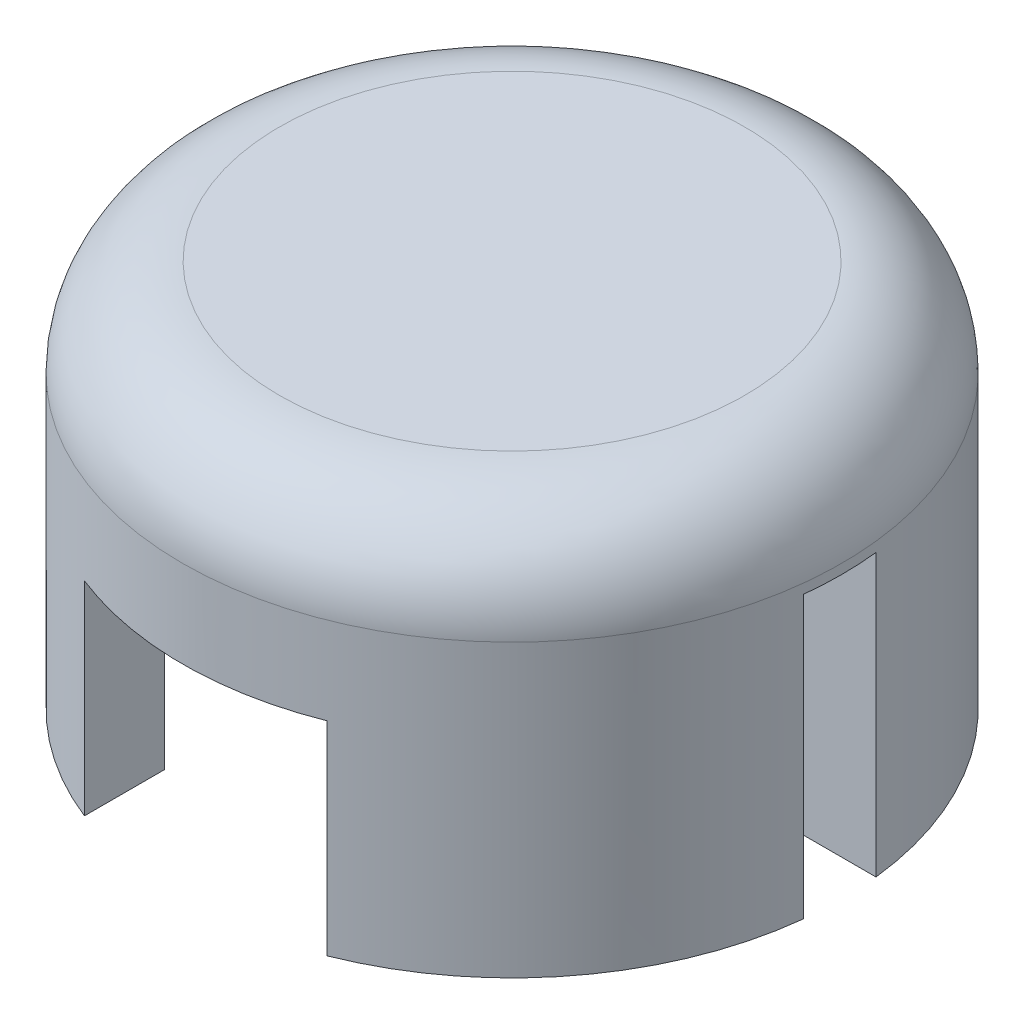
ISO-10303-21;
HEADER;
FILE_DESCRIPTION(('STEP AP214'),'2;1');
FILE_NAME('part.step','',(''),(''),'','','');
FILE_SCHEMA(('AUTOMOTIVE_DESIGN { 1 0 10303 214 1 1 1 1 }'));
ENDSEC;
DATA;
#1=APPLICATION_CONTEXT('core data for automotive mechanical design processes');
#2=APPLICATION_PROTOCOL_DEFINITION('international standard','automotive_design',2000,#1);
#3=PRODUCT_CONTEXT('',#1,'mechanical');
#4=PRODUCT('Part','Part','',(#3));
#5=PRODUCT_RELATED_PRODUCT_CATEGORY('part','',(#4));
#6=PRODUCT_DEFINITION_FORMATION('','',#4);
#7=PRODUCT_DEFINITION_CONTEXT('part definition',#1,'design');
#8=PRODUCT_DEFINITION('design','',#6,#7);
#9=PRODUCT_DEFINITION_SHAPE('','',#8);
#10=(LENGTH_UNIT() NAMED_UNIT(*) SI_UNIT(.MILLI.,.METRE.));
#11=(NAMED_UNIT(*) PLANE_ANGLE_UNIT() SI_UNIT($,.RADIAN.));
#12=(NAMED_UNIT(*) SI_UNIT($,.STERADIAN.) SOLID_ANGLE_UNIT());
#13=UNCERTAINTY_MEASURE_WITH_UNIT(LENGTH_MEASURE(1.E-05),#10,'distance_accuracy_value','');
#14=(GEOMETRIC_REPRESENTATION_CONTEXT(3) GLOBAL_UNCERTAINTY_ASSIGNED_CONTEXT((#13)) GLOBAL_UNIT_ASSIGNED_CONTEXT((#10,
#11,#12)) REPRESENTATION_CONTEXT('',''));
#15=CARTESIAN_POINT('',(0.,0.,0.));
#16=DIRECTION('',(0.,0.,1.));
#17=DIRECTION('',(1.,0.,0.));
#18=AXIS2_PLACEMENT_3D('',#15,#16,#17);
#19=CARTESIAN_POINT('',(0.,0.,0.));
#20=DIRECTION('',(0.,1.,0.));
#21=DIRECTION('',(0.,0.,1.));
#22=AXIS2_PLACEMENT_3D('',#19,#20,#21);
#23=PLANE('',#22);
#24=CARTESIAN_POINT('',(0.,0.,0.));
#25=DIRECTION('',(0.,1.,0.));
#26=DIRECTION('',(0.,0.,1.));
#27=AXIS2_PLACEMENT_3D('',#24,#25,#26);
#28=CIRCLE('',#27,5.3);
#29=CARTESIAN_POINT('',(2.5,0.,4.67332857821917));
#30=VERTEX_POINT('',#29);
#31=CARTESIAN_POINT('',(5.2466656077932,0.,0.75));
#32=VERTEX_POINT('',#31);
#33=EDGE_CURVE('E212',#30,#32,#28,.T.);
#34=ORIENTED_EDGE('',*,*,#33,.T.);
#35=DIRECTION('',(1.,0.,0.));
#36=VECTOR('',#35,1.);
#37=CARTESIAN_POINT('',(-6.8,0.,0.75));
#38=LINE('',#37,#36);
#39=CARTESIAN_POINT('',(6.75851315009448,0.,0.75));
#40=VERTEX_POINT('',#39);
#41=EDGE_CURVE('E251',#32,#40,#38,.T.);
#42=ORIENTED_EDGE('',*,*,#41,.T.);
#43=CARTESIAN_POINT('',(0.,0.,0.));
#44=DIRECTION('',(0.,1.,0.));
#45=DIRECTION('',(0.,0.,1.));
#46=AXIS2_PLACEMENT_3D('',#43,#44,#45);
#47=CIRCLE('',#46,6.8);
#48=CARTESIAN_POINT('',(2.5,0.,6.32376470150495));
#49=VERTEX_POINT('',#48);
#50=EDGE_CURVE('E219',#49,#40,#47,.T.);
#51=ORIENTED_EDGE('',*,*,#50,.F.);
#52=DIRECTION('',(0.,0.,-1.));
#53=VECTOR('',#52,1.);
#54=CARTESIAN_POINT('',(2.5,0.,6.8));
#55=LINE('',#54,#53);
#56=EDGE_CURVE('E181',#49,#30,#55,.T.);
#57=ORIENTED_EDGE('',*,*,#56,.T.);
#58=EDGE_LOOP('',(#34,#42,#51,#57));
#59=FACE_BOUND('',#58,.T.);
#60=ADVANCED_FACE('F39',(#59),#23,.F.);
#61=CARTESIAN_POINT('',(-6.75851315009448,0.,0.75));
#62=VERTEX_POINT('',#61);
#63=CARTESIAN_POINT('',(-2.5,0.,6.32376470150495));
#64=VERTEX_POINT('',#63);
#65=EDGE_CURVE('E216',#62,#64,#47,.T.);
#66=ORIENTED_EDGE('',*,*,#65,.F.);
#67=CARTESIAN_POINT('',(-5.2466656077932,0.,0.75));
#68=VERTEX_POINT('',#67);
#69=EDGE_CURVE('E282',#62,#68,#38,.T.);
#70=ORIENTED_EDGE('',*,*,#69,.T.);
#71=CARTESIAN_POINT('',(-2.5,0.,4.67332857821917));
#72=VERTEX_POINT('',#71);
#73=EDGE_CURVE('E218',#68,#72,#28,.T.);
#74=ORIENTED_EDGE('',*,*,#73,.T.);
#75=DIRECTION('',(0.,0.,-1.));
#76=VECTOR('',#75,1.);
#77=CARTESIAN_POINT('',(-2.5,0.,6.8));
#78=LINE('',#77,#76);
#79=EDGE_CURVE('E185',#64,#72,#78,.T.);
#80=ORIENTED_EDGE('',*,*,#79,.F.);
#81=EDGE_LOOP('',(#66,#70,#74,#80));
#82=FACE_BOUND('',#81,.T.);
#83=ADVANCED_FACE('F293',(#82),#23,.F.);
#84=CARTESIAN_POINT('',(0.,5.8,0.));
#85=DIRECTION('',(0.,-1.,0.));
#86=DIRECTION('',(0.,0.,-1.));
#87=AXIS2_PLACEMENT_3D('',#84,#85,#86);
#88=CYLINDRICAL_SURFACE('',#87,5.3);
#89=DIRECTION('',(0.,-1.,0.));
#90=VECTOR('',#89,1.);
#91=CARTESIAN_POINT('',(-5.2466656077932,5.8,0.75));
#92=LINE('',#91,#90);
#93=CARTESIAN_POINT('',(-5.2466656077932,5.8,0.75));
#94=VERTEX_POINT('',#93);
#95=EDGE_CURVE('E171',#94,#68,#92,.T.);
#96=ORIENTED_EDGE('',*,*,#95,.F.);
#97=CARTESIAN_POINT('',(0.,5.8,0.));
#98=DIRECTION('',(0.,1.,0.));
#99=DIRECTION('',(0.,0.,1.));
#100=AXIS2_PLACEMENT_3D('',#97,#98,#99);
#101=CIRCLE('',#100,5.3);
#102=CARTESIAN_POINT('',(5.2466656077932,5.8,0.75));
#103=VERTEX_POINT('',#102);
#104=EDGE_CURVE('E207',#94,#103,#101,.T.);
#105=ORIENTED_EDGE('',*,*,#104,.T.);
#106=DIRECTION('',(0.,-1.,0.));
#107=VECTOR('',#106,1.);
#108=CARTESIAN_POINT('',(5.2466656077932,5.8,0.75));
#109=LINE('',#108,#107);
#110=EDGE_CURVE('E164',#32,#103,#109,.F.);
#111=ORIENTED_EDGE('',*,*,#110,.F.);
#112=ORIENTED_EDGE('',*,*,#33,.F.);
#113=DIRECTION('',(0.,-1.,0.));
#114=VECTOR('',#113,1.);
#115=CARTESIAN_POINT('',(2.5,5.8,4.67332857821917));
#116=LINE('',#115,#114);
#117=CARTESIAN_POINT('',(2.5,4.2,4.67332857821917));
#118=VERTEX_POINT('',#117);
#119=EDGE_CURVE('E48',#30,#118,#116,.F.);
#120=ORIENTED_EDGE('',*,*,#119,.T.);
#121=CARTESIAN_POINT('',(0.,4.2,0.));
#122=DIRECTION('',(0.,-1.,0.));
#123=DIRECTION('',(0.,0.,-1.));
#124=AXIS2_PLACEMENT_3D('',#121,#122,#123);
#125=CIRCLE('',#124,5.3);
#126=CARTESIAN_POINT('',(-2.5,4.2,4.67332857821917));
#127=VERTEX_POINT('',#126);
#128=EDGE_CURVE('E234',#118,#127,#125,.T.);
#129=ORIENTED_EDGE('',*,*,#128,.T.);
#130=DIRECTION('',(0.,-1.,0.));
#131=VECTOR('',#130,1.);
#132=CARTESIAN_POINT('',(-2.5,5.8,4.67332857821917));
#133=LINE('',#132,#131);
#134=EDGE_CURVE('E230',#127,#72,#133,.T.);
#135=ORIENTED_EDGE('',*,*,#134,.T.);
#136=ORIENTED_EDGE('',*,*,#73,.F.);
#137=EDGE_LOOP('',(#96,#105,#111,#112,#120,#129,#135,#136));
#138=FACE_BOUND('',#137,.T.);
#139=ADVANCED_FACE('F242',(#138),#88,.F.);
#140=CARTESIAN_POINT('',(6.75851315009448,0.,-0.75));
#141=VERTEX_POINT('',#140);
#142=CARTESIAN_POINT('',(-6.75851315009448,0.,-0.75));
#143=VERTEX_POINT('',#142);
#144=EDGE_CURVE('E157',#141,#143,#47,.T.);
#145=ORIENTED_EDGE('',*,*,#144,.F.);
#146=DIRECTION('',(1.,0.,0.));
#147=VECTOR('',#146,1.);
#148=CARTESIAN_POINT('',(-6.8,0.,-0.75));
#149=LINE('',#148,#147);
#150=CARTESIAN_POINT('',(5.2466656077932,0.,-0.75));
#151=VERTEX_POINT('',#150);
#152=EDGE_CURVE('E276',#151,#141,#149,.T.);
#153=ORIENTED_EDGE('',*,*,#152,.F.);
#154=CARTESIAN_POINT('',(-5.2466656077932,0.,-0.75));
#155=VERTEX_POINT('',#154);
#156=EDGE_CURVE('E217',#151,#155,#28,.T.);
#157=ORIENTED_EDGE('',*,*,#156,.T.);
#158=EDGE_CURVE('E55',#143,#155,#149,.T.);
#159=ORIENTED_EDGE('',*,*,#158,.F.);
#160=EDGE_LOOP('',(#145,#153,#157,#159));
#161=FACE_BOUND('',#160,.T.);
#162=ADVANCED_FACE('F320',(#161),#23,.F.);
#163=CARTESIAN_POINT('',(0.,5.8,0.));
#164=DIRECTION('',(0.,-1.,0.));
#165=DIRECTION('',(0.,0.,-1.));
#166=AXIS2_PLACEMENT_3D('',#163,#164,#165);
#167=CYLINDRICAL_SURFACE('',#166,6.8);
#168=CARTESIAN_POINT('',(0.,6.,0.));
#169=DIRECTION('',(0.,1.,0.));
#170=DIRECTION('',(0.,0.,1.));
#171=AXIS2_PLACEMENT_3D('',#168,#169,#170);
#172=CIRCLE('',#171,6.8);
#173=CARTESIAN_POINT('',(0.,6.,6.8));
#174=VERTEX_POINT('',#173);
#175=EDGE_CURVE('E226',#174,#174,#172,.F.);
#176=ORIENTED_EDGE('',*,*,#175,.T.);
#177=EDGE_LOOP('',(#176));
#178=FACE_BOUND('',#177,.T.);
#179=ORIENTED_EDGE('',*,*,#50,.T.);
#180=DIRECTION('',(0.,-1.,0.));
#181=VECTOR('',#180,1.);
#182=CARTESIAN_POINT('',(6.75851315009448,5.8,0.75));
#183=LINE('',#182,#181);
#184=CARTESIAN_POINT('',(6.75851315009448,5.8,0.75));
#185=VERTEX_POINT('',#184);
#186=EDGE_CURVE('E174',#40,#185,#183,.F.);
#187=ORIENTED_EDGE('',*,*,#186,.T.);
#188=CARTESIAN_POINT('',(0.,5.8,0.));
#189=DIRECTION('',(0.,1.,0.));
#190=DIRECTION('',(0.,0.,1.));
#191=AXIS2_PLACEMENT_3D('',#188,#189,#190);
#192=CIRCLE('',#191,6.8);
#193=CARTESIAN_POINT('',(6.75851315009448,5.8,-0.75));
#194=VERTEX_POINT('',#193);
#195=EDGE_CURVE('E143',#185,#194,#192,.T.);
#196=ORIENTED_EDGE('',*,*,#195,.T.);
#197=DIRECTION('',(0.,-1.,0.));
#198=VECTOR('',#197,1.);
#199=CARTESIAN_POINT('',(6.75851315009448,5.8,-0.75));
#200=LINE('',#199,#198);
#201=EDGE_CURVE('E159',#194,#141,#200,.T.);
#202=ORIENTED_EDGE('',*,*,#201,.T.);
#203=ORIENTED_EDGE('',*,*,#144,.T.);
#204=DIRECTION('',(0.,-1.,0.));
#205=VECTOR('',#204,1.);
#206=CARTESIAN_POINT('',(-6.75851315009448,5.8,-0.75));
#207=LINE('',#206,#205);
#208=CARTESIAN_POINT('',(-6.75851315009448,5.8,-0.75));
#209=VERTEX_POINT('',#208);
#210=EDGE_CURVE('E147',#143,#209,#207,.F.);
#211=ORIENTED_EDGE('',*,*,#210,.T.);
#212=CARTESIAN_POINT('',(-6.75851315009448,5.8,0.75));
#213=VERTEX_POINT('',#212);
#214=EDGE_CURVE('E130',#209,#213,#192,.T.);
#215=ORIENTED_EDGE('',*,*,#214,.T.);
#216=DIRECTION('',(0.,-1.,0.));
#217=VECTOR('',#216,1.);
#218=CARTESIAN_POINT('',(-6.75851315009448,5.8,0.75));
#219=LINE('',#218,#217);
#220=EDGE_CURVE('E144',#213,#62,#219,.T.);
#221=ORIENTED_EDGE('',*,*,#220,.T.);
#222=ORIENTED_EDGE('',*,*,#65,.T.);
#223=DIRECTION('',(0.,-1.,0.));
#224=VECTOR('',#223,1.);
#225=CARTESIAN_POINT('',(-2.5,5.8,6.32376470150495));
#226=LINE('',#225,#224);
#227=CARTESIAN_POINT('',(-2.5,4.2,6.32376470150495));
#228=VERTEX_POINT('',#227);
#229=EDGE_CURVE('E197',#228,#64,#226,.T.);
#230=ORIENTED_EDGE('',*,*,#229,.F.);
#231=CARTESIAN_POINT('',(0.,4.2,0.));
#232=DIRECTION('',(0.,-1.,0.));
#233=DIRECTION('',(0.,0.,-1.));
#234=AXIS2_PLACEMENT_3D('',#231,#232,#233);
#235=CIRCLE('',#234,6.8);
#236=CARTESIAN_POINT('',(2.5,4.2,6.32376470150495));
#237=VERTEX_POINT('',#236);
#238=EDGE_CURVE('E201',#237,#228,#235,.T.);
#239=ORIENTED_EDGE('',*,*,#238,.F.);
#240=DIRECTION('',(0.,-1.,0.));
#241=VECTOR('',#240,1.);
#242=CARTESIAN_POINT('',(2.5,5.8,6.32376470150495));
#243=LINE('',#242,#241);
#244=EDGE_CURVE('E204',#49,#237,#243,.F.);
#245=ORIENTED_EDGE('',*,*,#244,.F.);
#246=EDGE_LOOP('',(#179,#187,#196,#202,#203,#211,#215,#221,#222,#230,#239,#245));
#247=FACE_BOUND('',#246,.T.);
#248=ADVANCED_FACE('F154',(#178,#247),#167,.T.);
#249=DIRECTION('',(0.,-1.,0.));
#250=VECTOR('',#249,1.);
#251=CARTESIAN_POINT('',(5.2466656077932,5.8,-0.75));
#252=LINE('',#251,#250);
#253=CARTESIAN_POINT('',(5.2466656077932,5.8,-0.75));
#254=VERTEX_POINT('',#253);
#255=EDGE_CURVE('E160',#254,#151,#252,.T.);
#256=ORIENTED_EDGE('',*,*,#255,.F.);
#257=CARTESIAN_POINT('',(-5.2466656077932,5.8,-0.75));
#258=VERTEX_POINT('',#257);
#259=EDGE_CURVE('E211',#254,#258,#101,.T.);
#260=ORIENTED_EDGE('',*,*,#259,.T.);
#261=DIRECTION('',(0.,-1.,0.));
#262=VECTOR('',#261,1.);
#263=CARTESIAN_POINT('',(-5.2466656077932,5.8,-0.75));
#264=LINE('',#263,#262);
#265=EDGE_CURVE('E148',#155,#258,#264,.F.);
#266=ORIENTED_EDGE('',*,*,#265,.F.);
#267=ORIENTED_EDGE('',*,*,#156,.F.);
#268=EDGE_LOOP('',(#256,#260,#266,#267));
#269=FACE_BOUND('',#268,.T.);
#270=ADVANCED_FACE('F270',(#269),#88,.F.);
#271=CARTESIAN_POINT('',(0.,5.8,0.));
#272=DIRECTION('',(0.,1.,0.));
#273=DIRECTION('',(0.,0.,1.));
#274=AXIS2_PLACEMENT_3D('',#271,#272,#273);
#275=PLANE('',#274);
#276=CARTESIAN_POINT('',(0.,5.8,0.));
#277=DIRECTION('',(0.,1.,0.));
#278=DIRECTION('',(0.,0.,1.));
#279=AXIS2_PLACEMENT_3D('',#276,#277,#278);
#280=CIRCLE('',#279,3.);
#281=CARTESIAN_POINT('',(0.,5.8,3.));
#282=VERTEX_POINT('',#281);
#283=EDGE_CURVE('E11',#282,#282,#280,.F.);
#284=ORIENTED_EDGE('',*,*,#283,.F.);
#285=EDGE_LOOP('',(#284));
#286=FACE_BOUND('',#285,.T.);
#287=ORIENTED_EDGE('',*,*,#259,.F.);
#288=DIRECTION('',(1.,0.,0.));
#289=VECTOR('',#288,1.);
#290=CARTESIAN_POINT('',(-6.8,5.8,-0.75));
#291=LINE('',#290,#289);
#292=EDGE_CURVE('E63',#254,#194,#291,.T.);
#293=ORIENTED_EDGE('',*,*,#292,.T.);
#294=ORIENTED_EDGE('',*,*,#195,.F.);
#295=DIRECTION('',(1.,0.,0.));
#296=VECTOR('',#295,1.);
#297=CARTESIAN_POINT('',(-6.8,5.8,0.75));
#298=LINE('',#297,#296);
#299=EDGE_CURVE('E150',#103,#185,#298,.T.);
#300=ORIENTED_EDGE('',*,*,#299,.F.);
#301=ORIENTED_EDGE('',*,*,#104,.F.);
#302=EDGE_CURVE('E137',#213,#94,#298,.T.);
#303=ORIENTED_EDGE('',*,*,#302,.F.);
#304=ORIENTED_EDGE('',*,*,#214,.F.);
#305=EDGE_CURVE('E134',#209,#258,#291,.T.);
#306=ORIENTED_EDGE('',*,*,#305,.T.);
#307=EDGE_LOOP('',(#287,#293,#294,#300,#301,#303,#304,#306));
#308=FACE_BOUND('',#307,.T.);
#309=ADVANCED_FACE('F133',(#286,#308),#275,.F.);
#310=CARTESIAN_POINT('',(0.,8.,0.));
#311=DIRECTION('',(0.,1.,0.));
#312=DIRECTION('',(0.,0.,1.));
#313=AXIS2_PLACEMENT_3D('',#310,#311,#312);
#314=PLANE('',#313);
#315=CARTESIAN_POINT('',(0.,8.,0.));
#316=DIRECTION('',(0.,1.,0.));
#317=DIRECTION('',(0.,0.,1.));
#318=AXIS2_PLACEMENT_3D('',#315,#316,#317);
#319=CIRCLE('',#318,4.8);
#320=CARTESIAN_POINT('',(0.,8.,4.8));
#321=VERTEX_POINT('',#320);
#322=EDGE_CURVE('E222',#321,#321,#319,.T.);
#323=ORIENTED_EDGE('',*,*,#322,.T.);
#324=EDGE_LOOP('',(#323));
#325=FACE_BOUND('',#324,.T.);
#326=ADVANCED_FACE('F309',(#325),#314,.T.);
#327=CARTESIAN_POINT('',(0.,6.,0.));
#328=DIRECTION('',(0.,1.,0.));
#329=DIRECTION('',(0.,0.,1.));
#330=AXIS2_PLACEMENT_3D('',#327,#328,#329);
#331=TOROIDAL_SURFACE('',#330,4.8,2.);
#332=ORIENTED_EDGE('',*,*,#175,.F.);
#333=EDGE_LOOP('',(#332));
#334=FACE_BOUND('',#333,.T.);
#335=ORIENTED_EDGE('',*,*,#322,.F.);
#336=EDGE_LOOP('',(#335));
#337=FACE_BOUND('',#336,.T.);
#338=ADVANCED_FACE('F41',(#334,#337),#331,.T.);
#339=CARTESIAN_POINT('',(2.5,0.,6.8));
#340=DIRECTION('',(-1.,0.,0.));
#341=DIRECTION('',(0.,0.,1.));
#342=AXIS2_PLACEMENT_3D('',#339,#340,#341);
#343=PLANE('',#342);
#344=ORIENTED_EDGE('',*,*,#244,.T.);
#345=DIRECTION('',(0.,0.,-1.));
#346=VECTOR('',#345,1.);
#347=CARTESIAN_POINT('',(2.5,4.2,6.8));
#348=LINE('',#347,#346);
#349=EDGE_CURVE('E193',#237,#118,#348,.T.);
#350=ORIENTED_EDGE('',*,*,#349,.T.);
#351=ORIENTED_EDGE('',*,*,#119,.F.);
#352=ORIENTED_EDGE('',*,*,#56,.F.);
#353=EDGE_LOOP('',(#344,#350,#351,#352));
#354=FACE_BOUND('',#353,.T.);
#355=ADVANCED_FACE('F245',(#354),#343,.T.);
#356=CARTESIAN_POINT('',(2.5,4.2,6.8));
#357=DIRECTION('',(0.,-1.,0.));
#358=DIRECTION('',(0.,0.,-1.));
#359=AXIS2_PLACEMENT_3D('',#356,#357,#358);
#360=PLANE('',#359);
#361=ORIENTED_EDGE('',*,*,#238,.T.);
#362=DIRECTION('',(0.,0.,-1.));
#363=VECTOR('',#362,1.);
#364=CARTESIAN_POINT('',(-2.5,4.2,6.8));
#365=LINE('',#364,#363);
#366=EDGE_CURVE('E189',#228,#127,#365,.T.);
#367=ORIENTED_EDGE('',*,*,#366,.T.);
#368=ORIENTED_EDGE('',*,*,#128,.F.);
#369=ORIENTED_EDGE('',*,*,#349,.F.);
#370=EDGE_LOOP('',(#361,#367,#368,#369));
#371=FACE_BOUND('',#370,.T.);
#372=ADVANCED_FACE('F255',(#371),#360,.T.);
#373=CARTESIAN_POINT('',(-2.5,0.,6.8));
#374=DIRECTION('',(1.,0.,0.));
#375=DIRECTION('',(0.,1.,0.));
#376=AXIS2_PLACEMENT_3D('',#373,#374,#375);
#377=PLANE('',#376);
#378=ORIENTED_EDGE('',*,*,#229,.T.);
#379=ORIENTED_EDGE('',*,*,#79,.T.);
#380=ORIENTED_EDGE('',*,*,#134,.F.);
#381=ORIENTED_EDGE('',*,*,#366,.F.);
#382=EDGE_LOOP('',(#378,#379,#380,#381));
#383=FACE_BOUND('',#382,.T.);
#384=ADVANCED_FACE('F258',(#383),#377,.T.);
#385=CARTESIAN_POINT('',(-6.8,0.,-0.75));
#386=DIRECTION('',(0.,0.,-1.));
#387=DIRECTION('',(-1.,0.,0.));
#388=AXIS2_PLACEMENT_3D('',#385,#386,#387);
#389=PLANE('',#388);
#390=ORIENTED_EDGE('',*,*,#158,.T.);
#391=ORIENTED_EDGE('',*,*,#265,.T.);
#392=ORIENTED_EDGE('',*,*,#305,.F.);
#393=ORIENTED_EDGE('',*,*,#210,.F.);
#394=EDGE_LOOP('',(#390,#391,#392,#393));
#395=FACE_BOUND('',#394,.T.);
#396=ADVANCED_FACE('F146',(#395),#389,.F.);
#397=CARTESIAN_POINT('',(-6.8,0.,0.75));
#398=DIRECTION('',(0.,0.,1.));
#399=DIRECTION('',(1.,0.,0.));
#400=AXIS2_PLACEMENT_3D('',#397,#398,#399);
#401=PLANE('',#400);
#402=ORIENTED_EDGE('',*,*,#302,.T.);
#403=ORIENTED_EDGE('',*,*,#95,.T.);
#404=ORIENTED_EDGE('',*,*,#69,.F.);
#405=ORIENTED_EDGE('',*,*,#220,.F.);
#406=EDGE_LOOP('',(#402,#403,#404,#405));
#407=FACE_BOUND('',#406,.T.);
#408=ADVANCED_FACE('F292',(#407),#401,.F.);
#409=ORIENTED_EDGE('',*,*,#41,.F.);
#410=ORIENTED_EDGE('',*,*,#110,.T.);
#411=ORIENTED_EDGE('',*,*,#299,.T.);
#412=ORIENTED_EDGE('',*,*,#186,.F.);
#413=EDGE_LOOP('',(#409,#410,#411,#412));
#414=FACE_BOUND('',#413,.T.);
#415=ADVANCED_FACE('F290',(#414),#401,.F.);
#416=ORIENTED_EDGE('',*,*,#292,.F.);
#417=ORIENTED_EDGE('',*,*,#255,.T.);
#418=ORIENTED_EDGE('',*,*,#152,.T.);
#419=ORIENTED_EDGE('',*,*,#201,.F.);
#420=EDGE_LOOP('',(#416,#417,#418,#419));
#421=FACE_BOUND('',#420,.T.);
#422=ADVANCED_FACE('F304',(#421),#389,.F.);
#423=CARTESIAN_POINT('',(0.,3.3,0.));
#424=DIRECTION('',(0.,1.,0.));
#425=DIRECTION('',(0.,0.,1.));
#426=AXIS2_PLACEMENT_3D('',#423,#424,#425);
#427=CYLINDRICAL_SURFACE('',#426,3.);
#428=CARTESIAN_POINT('',(0.,3.3,0.));
#429=DIRECTION('',(0.,-1.,0.));
#430=DIRECTION('',(0.,0.,-1.));
#431=AXIS2_PLACEMENT_3D('',#428,#429,#430);
#432=CIRCLE('',#431,3.);
#433=CARTESIAN_POINT('',(0.,3.3,-3.));
#434=VERTEX_POINT('',#433);
#435=EDGE_CURVE('E284',#434,#434,#432,.T.);
#436=ORIENTED_EDGE('',*,*,#435,.F.);
#437=EDGE_LOOP('',(#436));
#438=FACE_BOUND('',#437,.T.);
#439=ORIENTED_EDGE('',*,*,#283,.T.);
#440=EDGE_LOOP('',(#439));
#441=FACE_BOUND('',#440,.T.);
#442=ADVANCED_FACE('F301',(#438,#441),#427,.T.);
#443=CARTESIAN_POINT('',(0.,3.3,0.));
#444=DIRECTION('',(0.,-1.,0.));
#445=DIRECTION('',(0.,0.,-1.));
#446=AXIS2_PLACEMENT_3D('',#443,#444,#445);
#447=PLANE('',#446);
#448=ORIENTED_EDGE('',*,*,#435,.T.);
#449=EDGE_LOOP('',(#448));
#450=FACE_BOUND('',#449,.T.);
#451=ADVANCED_FACE('F299',(#450),#447,.T.);
#452=CLOSED_SHELL('',(#60,#83,#139,#162,#248,#270,#309,#326,#338,#355,#372,#384,#396,#408,#415,
#422,#442,#451));
#453=MANIFOLD_SOLID_BREP('B2',#452);
#454=ADVANCED_BREP_SHAPE_REPRESENTATION('',(#18,#453),#14);
#455=SHAPE_DEFINITION_REPRESENTATION(#9,#454);
ENDSEC;
END-ISO-10303-21;
